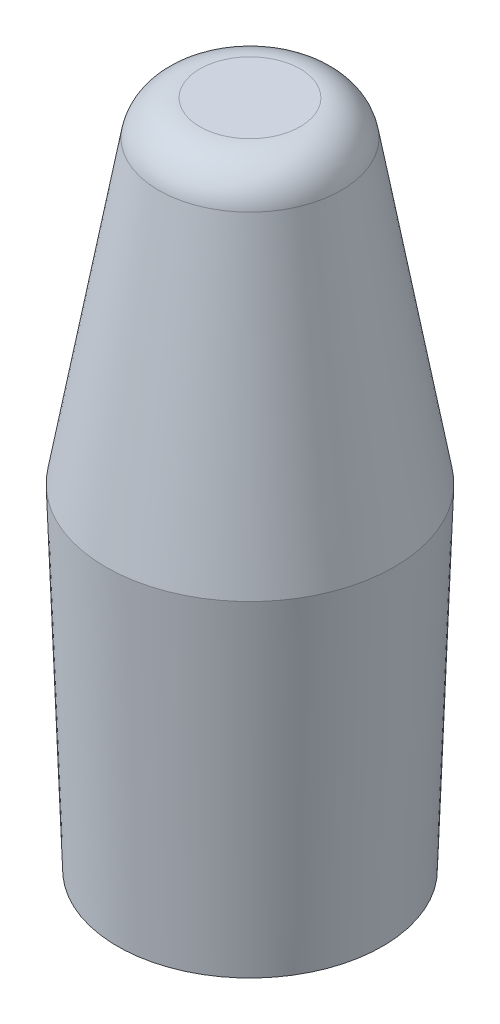
ISO-10303-21;
HEADER;
FILE_DESCRIPTION(('STEP AP214'),'2;1');
FILE_NAME('part.step','',(''),(''),'','','');
FILE_SCHEMA(('AUTOMOTIVE_DESIGN { 1 0 10303 214 1 1 1 1 }'));
ENDSEC;
DATA;
#1=APPLICATION_CONTEXT('core data for automotive mechanical design processes');
#2=APPLICATION_PROTOCOL_DEFINITION('international standard','automotive_design',2000,#1);
#3=PRODUCT_CONTEXT('',#1,'mechanical');
#4=PRODUCT('Part','Part','',(#3));
#5=PRODUCT_RELATED_PRODUCT_CATEGORY('part','',(#4));
#6=PRODUCT_DEFINITION_FORMATION('','',#4);
#7=PRODUCT_DEFINITION_CONTEXT('part definition',#1,'design');
#8=PRODUCT_DEFINITION('design','',#6,#7);
#9=PRODUCT_DEFINITION_SHAPE('','',#8);
#10=(LENGTH_UNIT() NAMED_UNIT(*) SI_UNIT(.MILLI.,.METRE.));
#11=(NAMED_UNIT(*) PLANE_ANGLE_UNIT() SI_UNIT($,.RADIAN.));
#12=(NAMED_UNIT(*) SI_UNIT($,.STERADIAN.) SOLID_ANGLE_UNIT());
#13=UNCERTAINTY_MEASURE_WITH_UNIT(LENGTH_MEASURE(1.E-05),#10,'distance_accuracy_value','');
#14=(GEOMETRIC_REPRESENTATION_CONTEXT(3) GLOBAL_UNCERTAINTY_ASSIGNED_CONTEXT((#13)) GLOBAL_UNIT_ASSIGNED_CONTEXT((#10,
#11,#12)) REPRESENTATION_CONTEXT('',''));
#15=CARTESIAN_POINT('',(0.,0.,0.));
#16=DIRECTION('',(0.,0.,1.));
#17=DIRECTION('',(1.,0.,0.));
#18=AXIS2_PLACEMENT_3D('',#15,#16,#17);
#19=CARTESIAN_POINT('',(0.,0.,0.));
#20=DIRECTION('',(0.,1.,0.));
#21=DIRECTION('',(0.,0.,-1.));
#22=AXIS2_PLACEMENT_3D('',#19,#20,#21);
#23=CONICAL_SURFACE('',#22,1.725,0.0349065850398867);
#24=CARTESIAN_POINT('',(0.,-4.,0.));
#25=DIRECTION('',(0.,-1.,0.));
#26=DIRECTION('',(0.,0.,-1.));
#27=AXIS2_PLACEMENT_3D('',#24,#25,#26);
#28=CIRCLE('',#27,1.58531692203301);
#29=CARTESIAN_POINT('',(0.,-4.,-1.58531692203301));
#30=VERTEX_POINT('',#29);
#31=EDGE_CURVE('E11',#30,#30,#28,.T.);
#32=ORIENTED_EDGE('',*,*,#31,.F.);
#33=EDGE_LOOP('',(#32));
#34=FACE_BOUND('',#33,.T.);
#35=CARTESIAN_POINT('',(0.,0.,0.));
#36=DIRECTION('',(0.,-1.,0.));
#37=DIRECTION('',(0.,0.,-1.));
#38=AXIS2_PLACEMENT_3D('',#35,#36,#37);
#39=CIRCLE('',#38,1.725);
#40=CARTESIAN_POINT('',(0.,0.,-1.725));
#41=VERTEX_POINT('',#40);
#42=EDGE_CURVE('E45',#41,#41,#39,.T.);
#43=ORIENTED_EDGE('',*,*,#42,.T.);
#44=EDGE_LOOP('',(#43));
#45=FACE_BOUND('',#44,.T.);
#46=ADVANCED_FACE('F39',(#34,#45),#23,.T.);
#47=CARTESIAN_POINT('',(0.,-4.,0.));
#48=DIRECTION('',(0.,-1.,0.));
#49=DIRECTION('',(0.,0.,-1.));
#50=AXIS2_PLACEMENT_3D('',#47,#48,#49);
#51=PLANE('',#50);
#52=ORIENTED_EDGE('',*,*,#31,.T.);
#53=EDGE_LOOP('',(#52));
#54=FACE_BOUND('',#53,.T.);
#55=ADVANCED_FACE('F54',(#54),#51,.T.);
#56=CARTESIAN_POINT('',(0.,0.,0.));
#57=DIRECTION('',(0.,-1.,0.));
#58=DIRECTION('',(0.,0.,-1.));
#59=AXIS2_PLACEMENT_3D('',#56,#57,#58);
#60=PLANE('',#59);
#61=ORIENTED_EDGE('',*,*,#42,.F.);
#62=EDGE_LOOP('',(#61));
#63=FACE_BOUND('',#62,.T.);
#64=ADVANCED_FACE('F52',(#63),#60,.F.);
#65=CLOSED_SHELL('',(#46,#55,#64));
#66=MANIFOLD_SOLID_BREP('B2',#65);
#67=CARTESIAN_POINT('',(0.,3.5,0.));
#68=DIRECTION('',(0.,1.,0.));
#69=DIRECTION('',(0.,0.,1.));
#70=AXIS2_PLACEMENT_3D('',#67,#68,#69);
#71=TOROIDAL_SURFACE('',#70,0.600142261577499,0.5);
#72=CARTESIAN_POINT('',(0.,3.58682408883347,0.));
#73=DIRECTION('',(0.,-1.,0.));
#74=DIRECTION('',(0.,0.,-1.));
#75=AXIS2_PLACEMENT_3D('',#72,#73,#74);
#76=CIRCLE('',#75,1.0925461380836);
#77=CARTESIAN_POINT('',(0.,3.58682408883347,-1.0925461380836));
#78=VERTEX_POINT('',#77);
#79=EDGE_CURVE('E86',#78,#78,#76,.T.);
#80=ORIENTED_EDGE('',*,*,#79,.F.);
#81=EDGE_LOOP('',(#80));
#82=FACE_BOUND('',#81,.T.);
#83=CARTESIAN_POINT('',(0.,4.,0.));
#84=DIRECTION('',(0.,1.,0.));
#85=DIRECTION('',(0.,0.,1.));
#86=AXIS2_PLACEMENT_3D('',#83,#84,#85);
#87=CIRCLE('',#86,0.600142261577499);
#88=CARTESIAN_POINT('',(0.,4.,0.600142261577499));
#89=VERTEX_POINT('',#88);
#90=EDGE_CURVE('E38',#89,#89,#87,.T.);
#91=ORIENTED_EDGE('',*,*,#90,.F.);
#92=EDGE_LOOP('',(#91));
#93=FACE_BOUND('',#92,.T.);
#94=ADVANCED_FACE('F80',(#82,#93),#71,.T.);
#95=CARTESIAN_POINT('',(0.,0.,0.));
#96=DIRECTION('',(0.,-1.,0.));
#97=DIRECTION('',(0.,0.,1.));
#98=AXIS2_PLACEMENT_3D('',#95,#96,#97);
#99=CONICAL_SURFACE('',#98,1.725,0.174532925199433);
#100=ORIENTED_EDGE('',*,*,#79,.T.);
#101=EDGE_LOOP('',(#100));
#102=FACE_BOUND('',#101,.T.);
#103=CARTESIAN_POINT('',(0.,0.,0.));
#104=DIRECTION('',(0.,1.,0.));
#105=DIRECTION('',(0.,0.,1.));
#106=AXIS2_PLACEMENT_3D('',#103,#104,#105);
#107=CIRCLE('',#106,1.725);
#108=CARTESIAN_POINT('',(0.,0.,1.725));
#109=VERTEX_POINT('',#108);
#110=EDGE_CURVE('E90',#109,#109,#107,.T.);
#111=ORIENTED_EDGE('',*,*,#110,.T.);
#112=EDGE_LOOP('',(#111));
#113=FACE_BOUND('',#112,.T.);
#114=ADVANCED_FACE('F97',(#102,#113),#99,.T.);
#115=CARTESIAN_POINT('',(0.,4.,0.));
#116=DIRECTION('',(0.,1.,0.));
#117=DIRECTION('',(0.,0.,1.));
#118=AXIS2_PLACEMENT_3D('',#115,#116,#117);
#119=PLANE('',#118);
#120=ORIENTED_EDGE('',*,*,#90,.T.);
#121=EDGE_LOOP('',(#120));
#122=FACE_BOUND('',#121,.T.);
#123=ADVANCED_FACE('F101',(#122),#119,.T.);
#124=CARTESIAN_POINT('',(0.,0.,0.));
#125=DIRECTION('',(0.,1.,0.));
#126=DIRECTION('',(0.,0.,1.));
#127=AXIS2_PLACEMENT_3D('',#124,#125,#126);
#128=PLANE('',#127);
#129=ORIENTED_EDGE('',*,*,#110,.F.);
#130=EDGE_LOOP('',(#129));
#131=FACE_BOUND('',#130,.T.);
#132=ADVANCED_FACE('F99',(#131),#128,.F.);
#133=CLOSED_SHELL('',(#94,#114,#123,#132));
#134=MANIFOLD_SOLID_BREP('B6',#133);
#135=ADVANCED_BREP_SHAPE_REPRESENTATION('',(#18,#66,#134),#14);
#136=SHAPE_DEFINITION_REPRESENTATION(#9,#135);
ENDSEC;
END-ISO-10303-21;
